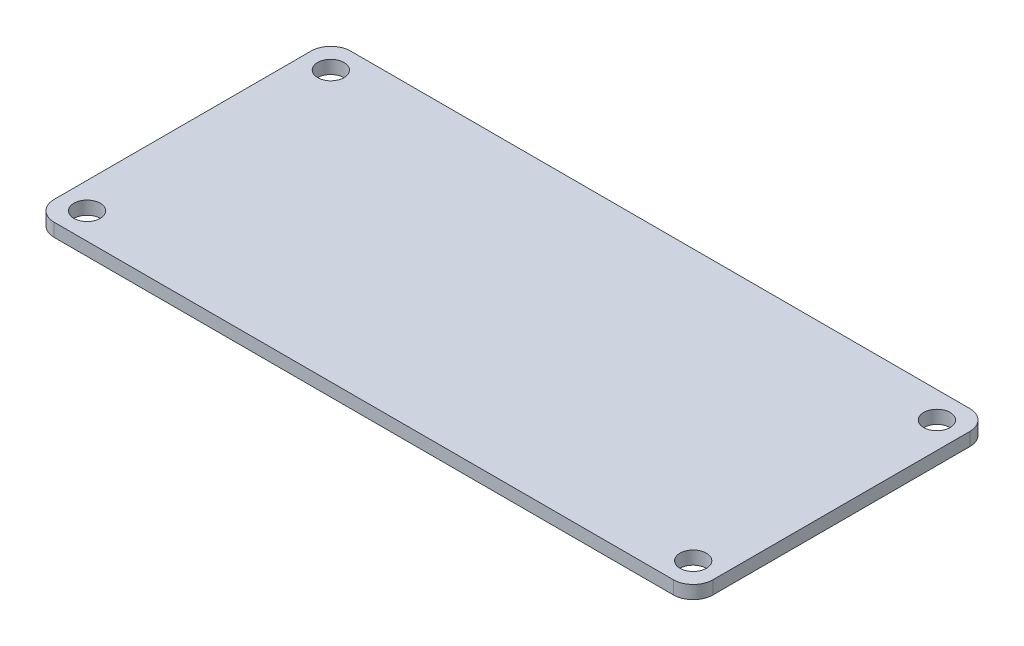
ISO-10303-21;
HEADER;
FILE_DESCRIPTION(('STEP AP214'),'2;1');
FILE_NAME('part.step','',(''),(''),'','','');
FILE_SCHEMA(('AUTOMOTIVE_DESIGN { 1 0 10303 214 1 1 1 1 }'));
ENDSEC;
DATA;
#1=APPLICATION_CONTEXT('core data for automotive mechanical design processes');
#2=APPLICATION_PROTOCOL_DEFINITION('international standard','automotive_design',2000,#1);
#3=PRODUCT_CONTEXT('',#1,'mechanical');
#4=PRODUCT('Part','Part','',(#3));
#5=PRODUCT_RELATED_PRODUCT_CATEGORY('part','',(#4));
#6=PRODUCT_DEFINITION_FORMATION('','',#4);
#7=PRODUCT_DEFINITION_CONTEXT('part definition',#1,'design');
#8=PRODUCT_DEFINITION('design','',#6,#7);
#9=PRODUCT_DEFINITION_SHAPE('','',#8);
#10=(LENGTH_UNIT() NAMED_UNIT(*) SI_UNIT(.MILLI.,.METRE.));
#11=(NAMED_UNIT(*) PLANE_ANGLE_UNIT() SI_UNIT($,.RADIAN.));
#12=(NAMED_UNIT(*) SI_UNIT($,.STERADIAN.) SOLID_ANGLE_UNIT());
#13=UNCERTAINTY_MEASURE_WITH_UNIT(LENGTH_MEASURE(1.E-05),#10,'distance_accuracy_value','');
#14=(GEOMETRIC_REPRESENTATION_CONTEXT(3) GLOBAL_UNCERTAINTY_ASSIGNED_CONTEXT((#13)) GLOBAL_UNIT_ASSIGNED_CONTEXT((#10,
#11,#12)) REPRESENTATION_CONTEXT('',''));
#15=CARTESIAN_POINT('',(0.,0.,0.));
#16=DIRECTION('',(0.,0.,1.));
#17=DIRECTION('',(1.,0.,0.));
#18=AXIS2_PLACEMENT_3D('',#15,#16,#17);
#19=CARTESIAN_POINT('',(-50.,2.,22.5));
#20=DIRECTION('',(1.,0.,0.));
#21=DIRECTION('',(0.,0.,-1.));
#22=AXIS2_PLACEMENT_3D('',#19,#20,#21);
#23=PLANE('',#22);
#24=DIRECTION('',(0.,0.,1.));
#25=VECTOR('',#24,1.);
#26=CARTESIAN_POINT('',(-50.,0.,22.5));
#27=LINE('',#26,#25);
#28=CARTESIAN_POINT('',(-50.,0.,-19.5));
#29=VERTEX_POINT('',#28);
#30=CARTESIAN_POINT('',(-50.,0.,19.5));
#31=VERTEX_POINT('',#30);
#32=EDGE_CURVE('E161',#29,#31,#27,.T.);
#33=ORIENTED_EDGE('',*,*,#32,.T.);
#34=DIRECTION('',(0.,-1.,0.));
#35=VECTOR('',#34,1.);
#36=CARTESIAN_POINT('',(-50.,2.,19.5));
#37=LINE('',#36,#35);
#38=CARTESIAN_POINT('',(-50.,2.,19.5));
#39=VERTEX_POINT('',#38);
#40=EDGE_CURVE('E11',#31,#39,#37,.F.);
#41=ORIENTED_EDGE('',*,*,#40,.T.);
#42=DIRECTION('',(0.,0.,1.));
#43=VECTOR('',#42,1.);
#44=CARTESIAN_POINT('',(-50.,2.,22.5));
#45=LINE('',#44,#43);
#46=CARTESIAN_POINT('',(-50.,2.,-19.5));
#47=VERTEX_POINT('',#46);
#48=EDGE_CURVE('E129',#47,#39,#45,.T.);
#49=ORIENTED_EDGE('',*,*,#48,.F.);
#50=DIRECTION('',(0.,-1.,0.));
#51=VECTOR('',#50,1.);
#52=CARTESIAN_POINT('',(-50.,2.,-19.5));
#53=LINE('',#52,#51);
#54=EDGE_CURVE('E45',#47,#29,#53,.T.);
#55=ORIENTED_EDGE('',*,*,#54,.T.);
#56=EDGE_LOOP('',(#33,#41,#49,#55));
#57=FACE_BOUND('',#56,.T.);
#58=ADVANCED_FACE('F37',(#57),#23,.F.);
#59=CARTESIAN_POINT('',(50.,2.,22.5));
#60=DIRECTION('',(0.,0.,-1.));
#61=DIRECTION('',(-1.,0.,0.));
#62=AXIS2_PLACEMENT_3D('',#59,#60,#61);
#63=PLANE('',#62);
#64=DIRECTION('',(1.,0.,0.));
#65=VECTOR('',#64,1.);
#66=CARTESIAN_POINT('',(50.,0.,22.5));
#67=LINE('',#66,#65);
#68=CARTESIAN_POINT('',(-47.,0.,22.5));
#69=VERTEX_POINT('',#68);
#70=CARTESIAN_POINT('',(47.,0.,22.5));
#71=VERTEX_POINT('',#70);
#72=EDGE_CURVE('E134',#69,#71,#67,.T.);
#73=ORIENTED_EDGE('',*,*,#72,.T.);
#74=DIRECTION('',(0.,-1.,0.));
#75=VECTOR('',#74,1.);
#76=CARTESIAN_POINT('',(47.,2.,22.5));
#77=LINE('',#76,#75);
#78=CARTESIAN_POINT('',(47.,2.,22.5));
#79=VERTEX_POINT('',#78);
#80=EDGE_CURVE('E52',#71,#79,#77,.F.);
#81=ORIENTED_EDGE('',*,*,#80,.T.);
#82=DIRECTION('',(1.,0.,0.));
#83=VECTOR('',#82,1.);
#84=CARTESIAN_POINT('',(50.,2.,22.5));
#85=LINE('',#84,#83);
#86=CARTESIAN_POINT('',(-47.,2.,22.5));
#87=VERTEX_POINT('',#86);
#88=EDGE_CURVE('E132',#87,#79,#85,.T.);
#89=ORIENTED_EDGE('',*,*,#88,.F.);
#90=DIRECTION('',(0.,-1.,0.));
#91=VECTOR('',#90,1.);
#92=CARTESIAN_POINT('',(-47.,2.,22.5));
#93=LINE('',#92,#91);
#94=EDGE_CURVE('E153',#87,#69,#93,.T.);
#95=ORIENTED_EDGE('',*,*,#94,.T.);
#96=EDGE_LOOP('',(#73,#81,#89,#95));
#97=FACE_BOUND('',#96,.T.);
#98=ADVANCED_FACE('F221',(#97),#63,.F.);
#99=CARTESIAN_POINT('',(50.,2.,-22.5));
#100=DIRECTION('',(-1.,0.,0.));
#101=DIRECTION('',(0.,0.,1.));
#102=AXIS2_PLACEMENT_3D('',#99,#100,#101);
#103=PLANE('',#102);
#104=DIRECTION('',(0.,0.,-1.));
#105=VECTOR('',#104,1.);
#106=CARTESIAN_POINT('',(50.,0.,-22.5));
#107=LINE('',#106,#105);
#108=CARTESIAN_POINT('',(50.,0.,19.5));
#109=VERTEX_POINT('',#108);
#110=CARTESIAN_POINT('',(50.,0.,-19.5));
#111=VERTEX_POINT('',#110);
#112=EDGE_CURVE('E130',#109,#111,#107,.T.);
#113=ORIENTED_EDGE('',*,*,#112,.T.);
#114=DIRECTION('',(0.,-1.,0.));
#115=VECTOR('',#114,1.);
#116=CARTESIAN_POINT('',(50.,2.,-19.5));
#117=LINE('',#116,#115);
#118=CARTESIAN_POINT('',(50.,2.,-19.5));
#119=VERTEX_POINT('',#118);
#120=EDGE_CURVE('E108',#111,#119,#117,.F.);
#121=ORIENTED_EDGE('',*,*,#120,.T.);
#122=DIRECTION('',(0.,0.,-1.));
#123=VECTOR('',#122,1.);
#124=CARTESIAN_POINT('',(50.,2.,-22.5));
#125=LINE('',#124,#123);
#126=CARTESIAN_POINT('',(50.,2.,19.5));
#127=VERTEX_POINT('',#126);
#128=EDGE_CURVE('E173',#127,#119,#125,.T.);
#129=ORIENTED_EDGE('',*,*,#128,.F.);
#130=DIRECTION('',(0.,-1.,0.));
#131=VECTOR('',#130,1.);
#132=CARTESIAN_POINT('',(50.,2.,19.5));
#133=LINE('',#132,#131);
#134=EDGE_CURVE('E113',#127,#109,#133,.T.);
#135=ORIENTED_EDGE('',*,*,#134,.T.);
#136=EDGE_LOOP('',(#113,#121,#129,#135));
#137=FACE_BOUND('',#136,.T.);
#138=ADVANCED_FACE('F218',(#137),#103,.F.);
#139=CARTESIAN_POINT('',(-50.,2.,-22.5));
#140=DIRECTION('',(0.,0.,1.));
#141=DIRECTION('',(1.,0.,0.));
#142=AXIS2_PLACEMENT_3D('',#139,#140,#141);
#143=PLANE('',#142);
#144=DIRECTION('',(-1.,0.,0.));
#145=VECTOR('',#144,1.);
#146=CARTESIAN_POINT('',(-50.,2.,-22.5));
#147=LINE('',#146,#145);
#148=CARTESIAN_POINT('',(47.,2.,-22.5));
#149=VERTEX_POINT('',#148);
#150=CARTESIAN_POINT('',(-47.,2.,-22.5));
#151=VERTEX_POINT('',#150);
#152=EDGE_CURVE('E123',#149,#151,#147,.T.);
#153=ORIENTED_EDGE('',*,*,#152,.F.);
#154=DIRECTION('',(0.,-1.,0.));
#155=VECTOR('',#154,1.);
#156=CARTESIAN_POINT('',(47.,2.,-22.5));
#157=LINE('',#156,#155);
#158=CARTESIAN_POINT('',(47.,0.,-22.5));
#159=VERTEX_POINT('',#158);
#160=EDGE_CURVE('E107',#149,#159,#157,.T.);
#161=ORIENTED_EDGE('',*,*,#160,.T.);
#162=DIRECTION('',(-1.,0.,0.));
#163=VECTOR('',#162,1.);
#164=CARTESIAN_POINT('',(-50.,0.,-22.5));
#165=LINE('',#164,#163);
#166=CARTESIAN_POINT('',(-47.,0.,-22.5));
#167=VERTEX_POINT('',#166);
#168=EDGE_CURVE('E120',#159,#167,#165,.T.);
#169=ORIENTED_EDGE('',*,*,#168,.T.);
#170=DIRECTION('',(0.,-1.,0.));
#171=VECTOR('',#170,1.);
#172=CARTESIAN_POINT('',(-47.,2.,-22.5));
#173=LINE('',#172,#171);
#174=EDGE_CURVE('E125',#167,#151,#173,.F.);
#175=ORIENTED_EDGE('',*,*,#174,.T.);
#176=EDGE_LOOP('',(#153,#161,#169,#175));
#177=FACE_BOUND('',#176,.T.);
#178=ADVANCED_FACE('F119',(#177),#143,.F.);
#179=CARTESIAN_POINT('',(0.,2.,0.));
#180=DIRECTION('',(0.,-1.,0.));
#181=DIRECTION('',(0.,0.,-1.));
#182=AXIS2_PLACEMENT_3D('',#179,#180,#181);
#183=PLANE('',#182);
#184=CARTESIAN_POINT('',(-46.,2.,-18.5));
#185=DIRECTION('',(0.,1.,0.));
#186=DIRECTION('',(0.,0.,-1.));
#187=AXIS2_PLACEMENT_3D('',#184,#185,#186);
#188=CIRCLE('',#187,2.);
#189=CARTESIAN_POINT('',(-46.,2.,-20.5));
#190=VERTEX_POINT('',#189);
#191=EDGE_CURVE('E180',#190,#190,#188,.T.);
#192=ORIENTED_EDGE('',*,*,#191,.F.);
#193=EDGE_LOOP('',(#192));
#194=FACE_BOUND('',#193,.T.);
#195=CARTESIAN_POINT('',(-46.,2.,18.5));
#196=DIRECTION('',(0.,1.,0.));
#197=DIRECTION('',(0.,0.,1.));
#198=AXIS2_PLACEMENT_3D('',#195,#196,#197);
#199=CIRCLE('',#198,2.);
#200=CARTESIAN_POINT('',(-46.,2.,20.5));
#201=VERTEX_POINT('',#200);
#202=EDGE_CURVE('E186',#201,#201,#199,.T.);
#203=ORIENTED_EDGE('',*,*,#202,.F.);
#204=EDGE_LOOP('',(#203));
#205=FACE_BOUND('',#204,.T.);
#206=CARTESIAN_POINT('',(46.,2.,18.5));
#207=DIRECTION('',(0.,1.,0.));
#208=DIRECTION('',(0.,0.,-1.));
#209=AXIS2_PLACEMENT_3D('',#206,#207,#208);
#210=CIRCLE('',#209,2.);
#211=CARTESIAN_POINT('',(46.,2.,16.5));
#212=VERTEX_POINT('',#211);
#213=EDGE_CURVE('E192',#212,#212,#210,.T.);
#214=ORIENTED_EDGE('',*,*,#213,.F.);
#215=EDGE_LOOP('',(#214));
#216=FACE_BOUND('',#215,.T.);
#217=CARTESIAN_POINT('',(46.,2.,-18.5));
#218=DIRECTION('',(0.,1.,0.));
#219=DIRECTION('',(0.,0.,1.));
#220=AXIS2_PLACEMENT_3D('',#217,#218,#219);
#221=CIRCLE('',#220,2.);
#222=CARTESIAN_POINT('',(46.,2.,-16.5));
#223=VERTEX_POINT('',#222);
#224=EDGE_CURVE('E169',#223,#223,#221,.T.);
#225=ORIENTED_EDGE('',*,*,#224,.F.);
#226=EDGE_LOOP('',(#225));
#227=FACE_BOUND('',#226,.T.);
#228=ORIENTED_EDGE('',*,*,#128,.T.);
#229=CARTESIAN_POINT('',(47.,2.,-19.5));
#230=DIRECTION('',(0.,-1.,0.));
#231=DIRECTION('',(0.,0.,-1.));
#232=AXIS2_PLACEMENT_3D('',#229,#230,#231);
#233=CIRCLE('',#232,3.);
#234=EDGE_CURVE('E151',#119,#149,#233,.F.);
#235=ORIENTED_EDGE('',*,*,#234,.T.);
#236=ORIENTED_EDGE('',*,*,#152,.T.);
#237=CARTESIAN_POINT('',(-47.,2.,-19.5));
#238=DIRECTION('',(0.,-1.,0.));
#239=DIRECTION('',(0.,0.,-1.));
#240=AXIS2_PLACEMENT_3D('',#237,#238,#239);
#241=CIRCLE('',#240,3.);
#242=EDGE_CURVE('E146',#151,#47,#241,.F.);
#243=ORIENTED_EDGE('',*,*,#242,.T.);
#244=ORIENTED_EDGE('',*,*,#48,.T.);
#245=CARTESIAN_POINT('',(-47.,2.,19.5));
#246=DIRECTION('',(0.,-1.,0.));
#247=DIRECTION('',(0.,0.,-1.));
#248=AXIS2_PLACEMENT_3D('',#245,#246,#247);
#249=CIRCLE('',#248,3.);
#250=EDGE_CURVE('E59',#39,#87,#249,.F.);
#251=ORIENTED_EDGE('',*,*,#250,.T.);
#252=ORIENTED_EDGE('',*,*,#88,.T.);
#253=CARTESIAN_POINT('',(47.,2.,19.5));
#254=DIRECTION('',(0.,-1.,0.));
#255=DIRECTION('',(0.,0.,-1.));
#256=AXIS2_PLACEMENT_3D('',#253,#254,#255);
#257=CIRCLE('',#256,3.);
#258=EDGE_CURVE('E149',#79,#127,#257,.F.);
#259=ORIENTED_EDGE('',*,*,#258,.T.);
#260=EDGE_LOOP('',(#228,#235,#236,#243,#244,#251,#252,#259));
#261=FACE_BOUND('',#260,.T.);
#262=ADVANCED_FACE('F208',(#194,#205,#216,#227,#261),#183,.F.);
#263=CARTESIAN_POINT('',(0.,0.,0.));
#264=DIRECTION('',(0.,-1.,0.));
#265=DIRECTION('',(0.,0.,-1.));
#266=AXIS2_PLACEMENT_3D('',#263,#264,#265);
#267=PLANE('',#266);
#268=CARTESIAN_POINT('',(-46.,0.,-18.5));
#269=DIRECTION('',(0.,1.,0.));
#270=DIRECTION('',(0.,0.,-1.));
#271=AXIS2_PLACEMENT_3D('',#268,#269,#270);
#272=CIRCLE('',#271,2.);
#273=CARTESIAN_POINT('',(-46.,0.,-20.5));
#274=VERTEX_POINT('',#273);
#275=EDGE_CURVE('E183',#274,#274,#272,.T.);
#276=ORIENTED_EDGE('',*,*,#275,.T.);
#277=EDGE_LOOP('',(#276));
#278=FACE_BOUND('',#277,.T.);
#279=CARTESIAN_POINT('',(-46.,0.,18.5));
#280=DIRECTION('',(0.,1.,0.));
#281=DIRECTION('',(0.,0.,1.));
#282=AXIS2_PLACEMENT_3D('',#279,#280,#281);
#283=CIRCLE('',#282,2.);
#284=CARTESIAN_POINT('',(-46.,0.,20.5));
#285=VERTEX_POINT('',#284);
#286=EDGE_CURVE('E189',#285,#285,#283,.T.);
#287=ORIENTED_EDGE('',*,*,#286,.T.);
#288=EDGE_LOOP('',(#287));
#289=FACE_BOUND('',#288,.T.);
#290=CARTESIAN_POINT('',(46.,0.,18.5));
#291=DIRECTION('',(0.,1.,0.));
#292=DIRECTION('',(0.,0.,-1.));
#293=AXIS2_PLACEMENT_3D('',#290,#291,#292);
#294=CIRCLE('',#293,2.);
#295=CARTESIAN_POINT('',(46.,0.,16.5));
#296=VERTEX_POINT('',#295);
#297=EDGE_CURVE('E178',#296,#296,#294,.T.);
#298=ORIENTED_EDGE('',*,*,#297,.T.);
#299=EDGE_LOOP('',(#298));
#300=FACE_BOUND('',#299,.T.);
#301=CARTESIAN_POINT('',(46.,0.,-18.5));
#302=DIRECTION('',(0.,1.,0.));
#303=DIRECTION('',(0.,0.,1.));
#304=AXIS2_PLACEMENT_3D('',#301,#302,#303);
#305=CIRCLE('',#304,2.);
#306=CARTESIAN_POINT('',(46.,0.,-16.5));
#307=VERTEX_POINT('',#306);
#308=EDGE_CURVE('E166',#307,#307,#305,.T.);
#309=ORIENTED_EDGE('',*,*,#308,.T.);
#310=EDGE_LOOP('',(#309));
#311=FACE_BOUND('',#310,.T.);
#312=ORIENTED_EDGE('',*,*,#168,.F.);
#313=CARTESIAN_POINT('',(47.,0.,-19.5));
#314=DIRECTION('',(0.,-1.,0.));
#315=DIRECTION('',(0.,0.,-1.));
#316=AXIS2_PLACEMENT_3D('',#313,#314,#315);
#317=CIRCLE('',#316,3.);
#318=EDGE_CURVE('E103',#159,#111,#317,.T.);
#319=ORIENTED_EDGE('',*,*,#318,.T.);
#320=ORIENTED_EDGE('',*,*,#112,.F.);
#321=CARTESIAN_POINT('',(47.,0.,19.5));
#322=DIRECTION('',(0.,-1.,0.));
#323=DIRECTION('',(0.,0.,-1.));
#324=AXIS2_PLACEMENT_3D('',#321,#322,#323);
#325=CIRCLE('',#324,3.);
#326=EDGE_CURVE('E114',#109,#71,#325,.T.);
#327=ORIENTED_EDGE('',*,*,#326,.T.);
#328=ORIENTED_EDGE('',*,*,#72,.F.);
#329=CARTESIAN_POINT('',(-47.,0.,19.5));
#330=DIRECTION('',(0.,-1.,0.));
#331=DIRECTION('',(0.,0.,-1.));
#332=AXIS2_PLACEMENT_3D('',#329,#330,#331);
#333=CIRCLE('',#332,3.);
#334=EDGE_CURVE('E140',#69,#31,#333,.T.);
#335=ORIENTED_EDGE('',*,*,#334,.T.);
#336=ORIENTED_EDGE('',*,*,#32,.F.);
#337=CARTESIAN_POINT('',(-47.,0.,-19.5));
#338=DIRECTION('',(0.,-1.,0.));
#339=DIRECTION('',(0.,0.,-1.));
#340=AXIS2_PLACEMENT_3D('',#337,#338,#339);
#341=CIRCLE('',#340,3.);
#342=EDGE_CURVE('E124',#29,#167,#341,.T.);
#343=ORIENTED_EDGE('',*,*,#342,.T.);
#344=EDGE_LOOP('',(#312,#319,#320,#327,#328,#335,#336,#343));
#345=FACE_BOUND('',#344,.T.);
#346=ADVANCED_FACE('F127',(#278,#289,#300,#311,#345),#267,.T.);
#347=CARTESIAN_POINT('',(46.,0.,-18.5));
#348=DIRECTION('',(0.,1.,0.));
#349=DIRECTION('',(0.,0.,1.));
#350=AXIS2_PLACEMENT_3D('',#347,#348,#349);
#351=CYLINDRICAL_SURFACE('',#350,2.);
#352=ORIENTED_EDGE('',*,*,#308,.F.);
#353=EDGE_LOOP('',(#352));
#354=FACE_BOUND('',#353,.T.);
#355=ORIENTED_EDGE('',*,*,#224,.T.);
#356=EDGE_LOOP('',(#355));
#357=FACE_BOUND('',#356,.T.);
#358=ADVANCED_FACE('F204',(#354,#357),#351,.F.);
#359=CARTESIAN_POINT('',(46.,0.,18.5));
#360=DIRECTION('',(0.,1.,0.));
#361=DIRECTION('',(0.,0.,1.));
#362=AXIS2_PLACEMENT_3D('',#359,#360,#361);
#363=CYLINDRICAL_SURFACE('',#362,2.);
#364=ORIENTED_EDGE('',*,*,#297,.F.);
#365=EDGE_LOOP('',(#364));
#366=FACE_BOUND('',#365,.T.);
#367=ORIENTED_EDGE('',*,*,#213,.T.);
#368=EDGE_LOOP('',(#367));
#369=FACE_BOUND('',#368,.T.);
#370=ADVANCED_FACE('F200',(#366,#369),#363,.F.);
#371=CARTESIAN_POINT('',(-46.,0.,18.5));
#372=DIRECTION('',(0.,1.,0.));
#373=DIRECTION('',(0.,0.,1.));
#374=AXIS2_PLACEMENT_3D('',#371,#372,#373);
#375=CYLINDRICAL_SURFACE('',#374,2.);
#376=ORIENTED_EDGE('',*,*,#286,.F.);
#377=EDGE_LOOP('',(#376));
#378=FACE_BOUND('',#377,.T.);
#379=ORIENTED_EDGE('',*,*,#202,.T.);
#380=EDGE_LOOP('',(#379));
#381=FACE_BOUND('',#380,.T.);
#382=ADVANCED_FACE('F203',(#378,#381),#375,.F.);
#383=CARTESIAN_POINT('',(-46.,0.,-18.5));
#384=DIRECTION('',(0.,1.,0.));
#385=DIRECTION('',(0.,0.,1.));
#386=AXIS2_PLACEMENT_3D('',#383,#384,#385);
#387=CYLINDRICAL_SURFACE('',#386,2.);
#388=ORIENTED_EDGE('',*,*,#275,.F.);
#389=EDGE_LOOP('',(#388));
#390=FACE_BOUND('',#389,.T.);
#391=ORIENTED_EDGE('',*,*,#191,.T.);
#392=EDGE_LOOP('',(#391));
#393=FACE_BOUND('',#392,.T.);
#394=ADVANCED_FACE('F239',(#390,#393),#387,.F.);
#395=CARTESIAN_POINT('',(47.,2.,-19.5));
#396=DIRECTION('',(0.,-1.,0.));
#397=DIRECTION('',(0.,0.,-1.));
#398=AXIS2_PLACEMENT_3D('',#395,#396,#397);
#399=CYLINDRICAL_SURFACE('',#398,3.);
#400=ORIENTED_EDGE('',*,*,#234,.F.);
#401=ORIENTED_EDGE('',*,*,#120,.F.);
#402=ORIENTED_EDGE('',*,*,#318,.F.);
#403=ORIENTED_EDGE('',*,*,#160,.F.);
#404=EDGE_LOOP('',(#400,#401,#402,#403));
#405=FACE_BOUND('',#404,.T.);
#406=ADVANCED_FACE('F106',(#405),#399,.T.);
#407=CARTESIAN_POINT('',(47.,2.,19.5));
#408=DIRECTION('',(0.,-1.,0.));
#409=DIRECTION('',(0.,0.,-1.));
#410=AXIS2_PLACEMENT_3D('',#407,#408,#409);
#411=CYLINDRICAL_SURFACE('',#410,3.);
#412=ORIENTED_EDGE('',*,*,#258,.F.);
#413=ORIENTED_EDGE('',*,*,#80,.F.);
#414=ORIENTED_EDGE('',*,*,#326,.F.);
#415=ORIENTED_EDGE('',*,*,#134,.F.);
#416=EDGE_LOOP('',(#412,#413,#414,#415));
#417=FACE_BOUND('',#416,.T.);
#418=ADVANCED_FACE('F220',(#417),#411,.T.);
#419=CARTESIAN_POINT('',(-47.,2.,19.5));
#420=DIRECTION('',(0.,-1.,0.));
#421=DIRECTION('',(0.,0.,-1.));
#422=AXIS2_PLACEMENT_3D('',#419,#420,#421);
#423=CYLINDRICAL_SURFACE('',#422,3.);
#424=ORIENTED_EDGE('',*,*,#250,.F.);
#425=ORIENTED_EDGE('',*,*,#40,.F.);
#426=ORIENTED_EDGE('',*,*,#334,.F.);
#427=ORIENTED_EDGE('',*,*,#94,.F.);
#428=EDGE_LOOP('',(#424,#425,#426,#427));
#429=FACE_BOUND('',#428,.T.);
#430=ADVANCED_FACE('F224',(#429),#423,.T.);
#431=CARTESIAN_POINT('',(-47.,2.,-19.5));
#432=DIRECTION('',(0.,-1.,0.));
#433=DIRECTION('',(0.,0.,-1.));
#434=AXIS2_PLACEMENT_3D('',#431,#432,#433);
#435=CYLINDRICAL_SURFACE('',#434,3.);
#436=ORIENTED_EDGE('',*,*,#242,.F.);
#437=ORIENTED_EDGE('',*,*,#174,.F.);
#438=ORIENTED_EDGE('',*,*,#342,.F.);
#439=ORIENTED_EDGE('',*,*,#54,.F.);
#440=EDGE_LOOP('',(#436,#437,#438,#439));
#441=FACE_BOUND('',#440,.T.);
#442=ADVANCED_FACE('F39',(#441),#435,.T.);
#443=CLOSED_SHELL('',(#58,#98,#138,#178,#262,#346,#358,#370,#382,#394,#406,#418,#430,#442));
#444=MANIFOLD_SOLID_BREP('B2',#443);
#445=ADVANCED_BREP_SHAPE_REPRESENTATION('',(#18,#444),#14);
#446=SHAPE_DEFINITION_REPRESENTATION(#9,#445);
ENDSEC;
END-ISO-10303-21;
